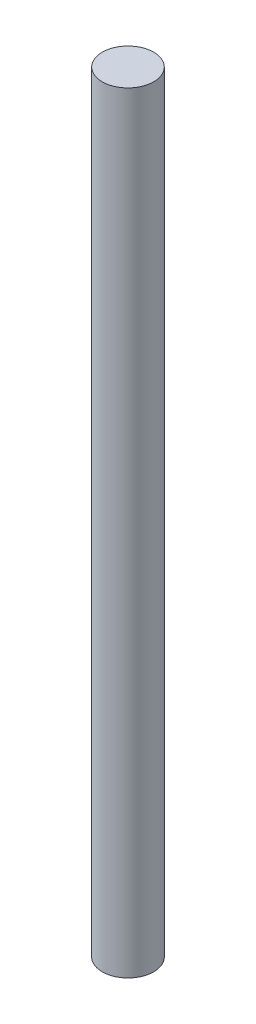
ISO-10303-21;
HEADER;
FILE_DESCRIPTION(('STEP AP214'),'2;1');
FILE_NAME('part.step','',(''),(''),'','','');
FILE_SCHEMA(('AUTOMOTIVE_DESIGN { 1 0 10303 214 1 1 1 1 }'));
ENDSEC;
DATA;
#1=APPLICATION_CONTEXT('core data for automotive mechanical design processes');
#2=APPLICATION_PROTOCOL_DEFINITION('international standard','automotive_design',2000,#1);
#3=PRODUCT_CONTEXT('',#1,'mechanical');
#4=PRODUCT('Part','Part','',(#3));
#5=PRODUCT_RELATED_PRODUCT_CATEGORY('part','',(#4));
#6=PRODUCT_DEFINITION_FORMATION('','',#4);
#7=PRODUCT_DEFINITION_CONTEXT('part definition',#1,'design');
#8=PRODUCT_DEFINITION('design','',#6,#7);
#9=PRODUCT_DEFINITION_SHAPE('','',#8);
#10=(LENGTH_UNIT() NAMED_UNIT(*) SI_UNIT(.MILLI.,.METRE.));
#11=(NAMED_UNIT(*) PLANE_ANGLE_UNIT() SI_UNIT($,.RADIAN.));
#12=(NAMED_UNIT(*) SI_UNIT($,.STERADIAN.) SOLID_ANGLE_UNIT());
#13=UNCERTAINTY_MEASURE_WITH_UNIT(LENGTH_MEASURE(1.E-05),#10,'distance_accuracy_value','');
#14=(GEOMETRIC_REPRESENTATION_CONTEXT(3) GLOBAL_UNCERTAINTY_ASSIGNED_CONTEXT((#13)) GLOBAL_UNIT_ASSIGNED_CONTEXT((#10,
#11,#12)) REPRESENTATION_CONTEXT('',''));
#15=CARTESIAN_POINT('',(0.,0.,0.));
#16=DIRECTION('',(0.,0.,1.));
#17=DIRECTION('',(1.,0.,0.));
#18=AXIS2_PLACEMENT_3D('',#15,#16,#17);
#19=CARTESIAN_POINT('',(0.,30.,0.));
#20=DIRECTION('',(0.,-1.,0.));
#21=DIRECTION('',(0.,0.,-1.));
#22=AXIS2_PLACEMENT_3D('',#19,#20,#21);
#23=CYLINDRICAL_SURFACE('',#22,1.);
#24=CARTESIAN_POINT('',(0.,30.,0.));
#25=DIRECTION('',(0.,1.,0.));
#26=DIRECTION('',(0.,0.,1.));
#27=AXIS2_PLACEMENT_3D('',#24,#25,#26);
#28=CIRCLE('',#27,1.);
#29=CARTESIAN_POINT('',(0.,30.,1.));
#30=VERTEX_POINT('',#29);
#31=EDGE_CURVE('E10',#30,#30,#28,.T.);
#32=ORIENTED_EDGE('',*,*,#31,.F.);
#33=EDGE_LOOP('',(#32));
#34=FACE_BOUND('',#33,.T.);
#35=CARTESIAN_POINT('',(0.,0.,0.));
#36=DIRECTION('',(0.,1.,0.));
#37=DIRECTION('',(0.,0.,1.));
#38=AXIS2_PLACEMENT_3D('',#35,#36,#37);
#39=CIRCLE('',#38,1.);
#40=CARTESIAN_POINT('',(0.,0.,1.));
#41=VERTEX_POINT('',#40);
#42=EDGE_CURVE('E33',#41,#41,#39,.T.);
#43=ORIENTED_EDGE('',*,*,#42,.T.);
#44=EDGE_LOOP('',(#43));
#45=FACE_BOUND('',#44,.T.);
#46=ADVANCED_FACE('F30',(#34,#45),#23,.T.);
#47=CARTESIAN_POINT('',(0.,30.,0.));
#48=DIRECTION('',(0.,1.,0.));
#49=DIRECTION('',(0.,0.,1.));
#50=AXIS2_PLACEMENT_3D('',#47,#48,#49);
#51=PLANE('',#50);
#52=ORIENTED_EDGE('',*,*,#31,.T.);
#53=EDGE_LOOP('',(#52));
#54=FACE_BOUND('',#53,.T.);
#55=ADVANCED_FACE('F45',(#54),#51,.T.);
#56=CARTESIAN_POINT('',(0.,0.,0.));
#57=DIRECTION('',(0.,1.,0.));
#58=DIRECTION('',(0.,0.,1.));
#59=AXIS2_PLACEMENT_3D('',#56,#57,#58);
#60=PLANE('',#59);
#61=ORIENTED_EDGE('',*,*,#42,.F.);
#62=EDGE_LOOP('',(#61));
#63=FACE_BOUND('',#62,.T.);
#64=ADVANCED_FACE('F43',(#63),#60,.F.);
#65=CLOSED_SHELL('',(#46,#55,#64));
#66=MANIFOLD_SOLID_BREP('B2',#65);
#67=ADVANCED_BREP_SHAPE_REPRESENTATION('',(#18,#66),#14);
#68=SHAPE_DEFINITION_REPRESENTATION(#9,#67);
ENDSEC;
END-ISO-10303-21;
